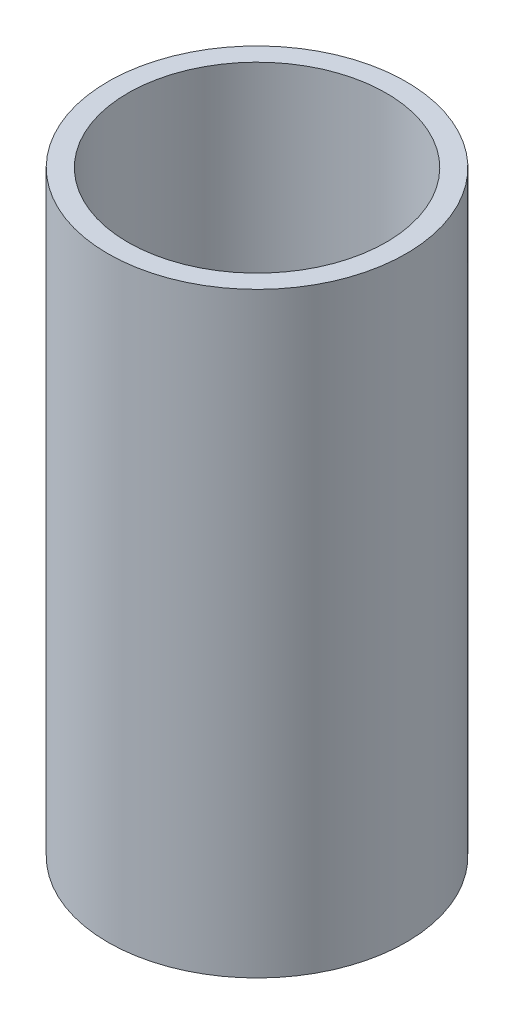
ISO-10303-21;
HEADER;
FILE_DESCRIPTION(('STEP AP214'),'2;1');
FILE_NAME('part.step','',(''),(''),'','','');
FILE_SCHEMA(('AUTOMOTIVE_DESIGN { 1 0 10303 214 1 1 1 1 }'));
ENDSEC;
DATA;
#1=APPLICATION_CONTEXT('core data for automotive mechanical design processes');
#2=APPLICATION_PROTOCOL_DEFINITION('international standard','automotive_design',2000,#1);
#3=PRODUCT_CONTEXT('',#1,'mechanical');
#4=PRODUCT('Part','Part','',(#3));
#5=PRODUCT_RELATED_PRODUCT_CATEGORY('part','',(#4));
#6=PRODUCT_DEFINITION_FORMATION('','',#4);
#7=PRODUCT_DEFINITION_CONTEXT('part definition',#1,'design');
#8=PRODUCT_DEFINITION('design','',#6,#7);
#9=PRODUCT_DEFINITION_SHAPE('','',#8);
#10=(LENGTH_UNIT() NAMED_UNIT(*) SI_UNIT(.MILLI.,.METRE.));
#11=(NAMED_UNIT(*) PLANE_ANGLE_UNIT() SI_UNIT($,.RADIAN.));
#12=(NAMED_UNIT(*) SI_UNIT($,.STERADIAN.) SOLID_ANGLE_UNIT());
#13=UNCERTAINTY_MEASURE_WITH_UNIT(LENGTH_MEASURE(1.E-05),#10,'distance_accuracy_value','');
#14=(GEOMETRIC_REPRESENTATION_CONTEXT(3) GLOBAL_UNCERTAINTY_ASSIGNED_CONTEXT((#13)) GLOBAL_UNIT_ASSIGNED_CONTEXT((#10,
#11,#12)) REPRESENTATION_CONTEXT('',''));
#15=CARTESIAN_POINT('',(0.,0.,0.));
#16=DIRECTION('',(0.,0.,1.));
#17=DIRECTION('',(1.,0.,0.));
#18=AXIS2_PLACEMENT_3D('',#15,#16,#17);
#19=CARTESIAN_POINT('',(0.,60.,0.));
#20=DIRECTION('',(0.,1.,0.));
#21=DIRECTION('',(0.,0.,1.));
#22=AXIS2_PLACEMENT_3D('',#19,#20,#21);
#23=PLANE('',#22);
#24=CARTESIAN_POINT('',(0.,60.,0.));
#25=DIRECTION('',(0.,1.,0.));
#26=DIRECTION('',(0.,0.,1.));
#27=AXIS2_PLACEMENT_3D('',#24,#25,#26);
#28=CIRCLE('',#27,30.);
#29=CARTESIAN_POINT('',(0.,60.,30.));
#30=VERTEX_POINT('',#29);
#31=EDGE_CURVE('E10',#30,#30,#28,.T.);
#32=ORIENTED_EDGE('',*,*,#31,.T.);
#33=EDGE_LOOP('',(#32));
#34=FACE_BOUND('',#33,.T.);
#35=CARTESIAN_POINT('',(0.,60.,0.));
#36=DIRECTION('',(0.,1.,0.));
#37=DIRECTION('',(0.,0.,1.));
#38=AXIS2_PLACEMENT_3D('',#35,#36,#37);
#39=CIRCLE('',#38,26.);
#40=CARTESIAN_POINT('',(0.,60.,26.));
#41=VERTEX_POINT('',#40);
#42=EDGE_CURVE('E42',#41,#41,#39,.T.);
#43=ORIENTED_EDGE('',*,*,#42,.F.);
#44=EDGE_LOOP('',(#43));
#45=FACE_BOUND('',#44,.T.);
#46=ADVANCED_FACE('F31',(#34,#45),#23,.T.);
#47=CARTESIAN_POINT('',(0.,-60.,0.));
#48=DIRECTION('',(0.,1.,0.));
#49=DIRECTION('',(0.,0.,1.));
#50=AXIS2_PLACEMENT_3D('',#47,#48,#49);
#51=PLANE('',#50);
#52=CARTESIAN_POINT('',(0.,-60.,0.));
#53=DIRECTION('',(0.,1.,0.));
#54=DIRECTION('',(0.,0.,1.));
#55=AXIS2_PLACEMENT_3D('',#52,#53,#54);
#56=CIRCLE('',#55,30.);
#57=CARTESIAN_POINT('',(0.,-60.,30.));
#58=VERTEX_POINT('',#57);
#59=EDGE_CURVE('E35',#58,#58,#56,.T.);
#60=ORIENTED_EDGE('',*,*,#59,.F.);
#61=EDGE_LOOP('',(#60));
#62=FACE_BOUND('',#61,.T.);
#63=CARTESIAN_POINT('',(0.,-60.,0.));
#64=DIRECTION('',(0.,1.,0.));
#65=DIRECTION('',(0.,0.,1.));
#66=AXIS2_PLACEMENT_3D('',#63,#64,#65);
#67=CIRCLE('',#66,26.);
#68=CARTESIAN_POINT('',(0.,-60.,26.));
#69=VERTEX_POINT('',#68);
#70=EDGE_CURVE('E44',#69,#69,#67,.T.);
#71=ORIENTED_EDGE('',*,*,#70,.T.);
#72=EDGE_LOOP('',(#71));
#73=FACE_BOUND('',#72,.T.);
#74=ADVANCED_FACE('F54',(#62,#73),#51,.F.);
#75=CARTESIAN_POINT('',(0.,60.,0.));
#76=DIRECTION('',(0.,-1.,0.));
#77=DIRECTION('',(0.,0.,-1.));
#78=AXIS2_PLACEMENT_3D('',#75,#76,#77);
#79=CYLINDRICAL_SURFACE('',#78,30.);
#80=ORIENTED_EDGE('',*,*,#31,.F.);
#81=EDGE_LOOP('',(#80));
#82=FACE_BOUND('',#81,.T.);
#83=ORIENTED_EDGE('',*,*,#59,.T.);
#84=EDGE_LOOP('',(#83));
#85=FACE_BOUND('',#84,.T.);
#86=ADVANCED_FACE('F33',(#82,#85),#79,.T.);
#87=CARTESIAN_POINT('',(0.,60.,0.));
#88=DIRECTION('',(0.,-1.,0.));
#89=DIRECTION('',(0.,0.,-1.));
#90=AXIS2_PLACEMENT_3D('',#87,#88,#89);
#91=CYLINDRICAL_SURFACE('',#90,26.);
#92=ORIENTED_EDGE('',*,*,#42,.T.);
#93=EDGE_LOOP('',(#92));
#94=FACE_BOUND('',#93,.T.);
#95=ORIENTED_EDGE('',*,*,#70,.F.);
#96=EDGE_LOOP('',(#95));
#97=FACE_BOUND('',#96,.T.);
#98=ADVANCED_FACE('F50',(#94,#97),#91,.F.);
#99=CLOSED_SHELL('',(#46,#74,#86,#98));
#100=MANIFOLD_SOLID_BREP('B2',#99);
#101=ADVANCED_BREP_SHAPE_REPRESENTATION('',(#18,#100),#14);
#102=SHAPE_DEFINITION_REPRESENTATION(#9,#101);
ENDSEC;
END-ISO-10303-21;
